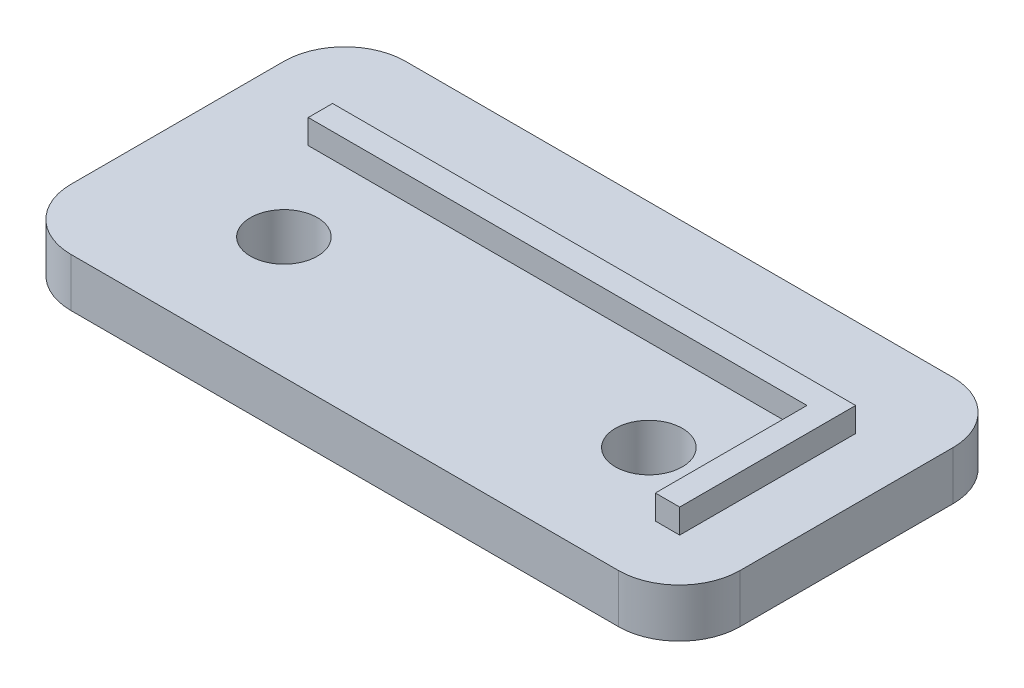
ISO-10303-21;
HEADER;
FILE_DESCRIPTION(('STEP AP214'),'2;1');
FILE_NAME('part.step','',(''),(''),'','','');
FILE_SCHEMA(('AUTOMOTIVE_DESIGN { 1 0 10303 214 1 1 1 1 }'));
ENDSEC;
DATA;
#1=APPLICATION_CONTEXT('core data for automotive mechanical design processes');
#2=APPLICATION_PROTOCOL_DEFINITION('international standard','automotive_design',2000,#1);
#3=PRODUCT_CONTEXT('',#1,'mechanical');
#4=PRODUCT('Part','Part','',(#3));
#5=PRODUCT_RELATED_PRODUCT_CATEGORY('part','',(#4));
#6=PRODUCT_DEFINITION_FORMATION('','',#4);
#7=PRODUCT_DEFINITION_CONTEXT('part definition',#1,'design');
#8=PRODUCT_DEFINITION('design','',#6,#7);
#9=PRODUCT_DEFINITION_SHAPE('','',#8);
#10=(LENGTH_UNIT() NAMED_UNIT(*) SI_UNIT(.MILLI.,.METRE.));
#11=(NAMED_UNIT(*) PLANE_ANGLE_UNIT() SI_UNIT($,.RADIAN.));
#12=(NAMED_UNIT(*) SI_UNIT($,.STERADIAN.) SOLID_ANGLE_UNIT());
#13=UNCERTAINTY_MEASURE_WITH_UNIT(LENGTH_MEASURE(1.E-05),#10,'distance_accuracy_value','');
#14=(GEOMETRIC_REPRESENTATION_CONTEXT(3) GLOBAL_UNCERTAINTY_ASSIGNED_CONTEXT((#13)) GLOBAL_UNIT_ASSIGNED_CONTEXT((#10,
#11,#12)) REPRESENTATION_CONTEXT('',''));
#15=CARTESIAN_POINT('',(0.,0.,0.));
#16=DIRECTION('',(0.,0.,1.));
#17=DIRECTION('',(1.,0.,0.));
#18=AXIS2_PLACEMENT_3D('',#15,#16,#17);
#19=CARTESIAN_POINT('',(0.,4.,0.));
#20=DIRECTION('',(0.,1.,0.));
#21=DIRECTION('',(0.,0.,1.));
#22=AXIS2_PLACEMENT_3D('',#19,#20,#21);
#23=PLANE('',#22);
#24=CARTESIAN_POINT('',(-12.5,4.,-10.));
#25=DIRECTION('',(0.,1.,0.));
#26=DIRECTION('',(0.,0.,1.));
#27=AXIS2_PLACEMENT_3D('',#24,#25,#26);
#28=CIRCLE('',#27,2.75);
#29=CARTESIAN_POINT('',(-12.5,4.,-7.25));
#30=VERTEX_POINT('',#29);
#31=EDGE_CURVE('E150',#30,#30,#28,.F.);
#32=ORIENTED_EDGE('',*,*,#31,.T.);
#33=EDGE_LOOP('',(#32));
#34=FACE_BOUND('',#33,.T.);
#35=DIRECTION('',(-1.,0.,0.));
#36=VECTOR('',#35,1.);
#37=CARTESIAN_POINT('',(0.,4.,-27.5));
#38=LINE('',#37,#36);
#39=CARTESIAN_POINT('',(-5.,4.,-27.5));
#40=VERTEX_POINT('',#39);
#41=CARTESIAN_POINT('',(-50.,4.,-27.5));
#42=VERTEX_POINT('',#41);
#43=EDGE_CURVE('E211',#40,#42,#38,.T.);
#44=ORIENTED_EDGE('',*,*,#43,.T.);
#45=CARTESIAN_POINT('',(-50.,4.,-22.5));
#46=DIRECTION('',(0.,1.,0.));
#47=DIRECTION('',(0.,0.,1.));
#48=AXIS2_PLACEMENT_3D('',#45,#46,#47);
#49=CIRCLE('',#48,5.);
#50=CARTESIAN_POINT('',(-55.,4.,-22.5));
#51=VERTEX_POINT('',#50);
#52=EDGE_CURVE('E255',#42,#51,#49,.T.);
#53=ORIENTED_EDGE('',*,*,#52,.T.);
#54=DIRECTION('',(0.,0.,1.));
#55=VECTOR('',#54,1.);
#56=CARTESIAN_POINT('',(-55.,4.,0.));
#57=LINE('',#56,#55);
#58=CARTESIAN_POINT('',(-55.,4.,-4.99999999999999));
#59=VERTEX_POINT('',#58);
#60=EDGE_CURVE('E215',#51,#59,#57,.T.);
#61=ORIENTED_EDGE('',*,*,#60,.T.);
#62=CARTESIAN_POINT('',(-50.,4.,-4.99999999999999));
#63=DIRECTION('',(0.,1.,0.));
#64=DIRECTION('',(0.,0.,1.));
#65=AXIS2_PLACEMENT_3D('',#62,#63,#64);
#66=CIRCLE('',#65,5.);
#67=CARTESIAN_POINT('',(-50.,4.,0.));
#68=VERTEX_POINT('',#67);
#69=EDGE_CURVE('E249',#59,#68,#66,.T.);
#70=ORIENTED_EDGE('',*,*,#69,.T.);
#71=DIRECTION('',(1.,0.,0.));
#72=VECTOR('',#71,1.);
#73=CARTESIAN_POINT('',(0.,4.,0.));
#74=LINE('',#73,#72);
#75=CARTESIAN_POINT('',(-5.,4.,0.));
#76=VERTEX_POINT('',#75);
#77=EDGE_CURVE('E218',#68,#76,#74,.T.);
#78=ORIENTED_EDGE('',*,*,#77,.T.);
#79=CARTESIAN_POINT('',(-5.,4.,-5.));
#80=DIRECTION('',(0.,1.,0.));
#81=DIRECTION('',(0.,0.,1.));
#82=AXIS2_PLACEMENT_3D('',#79,#80,#81);
#83=CIRCLE('',#82,5.);
#84=CARTESIAN_POINT('',(0.,4.,-5.));
#85=VERTEX_POINT('',#84);
#86=EDGE_CURVE('E251',#76,#85,#83,.T.);
#87=ORIENTED_EDGE('',*,*,#86,.T.);
#88=DIRECTION('',(0.,0.,-1.));
#89=VECTOR('',#88,1.);
#90=CARTESIAN_POINT('',(0.,4.,0.));
#91=LINE('',#90,#89);
#92=CARTESIAN_POINT('',(0.,4.,-22.5));
#93=VERTEX_POINT('',#92);
#94=EDGE_CURVE('E208',#85,#93,#91,.T.);
#95=ORIENTED_EDGE('',*,*,#94,.T.);
#96=CARTESIAN_POINT('',(-5.,4.,-22.5));
#97=DIRECTION('',(0.,1.,0.));
#98=DIRECTION('',(0.,0.,1.));
#99=AXIS2_PLACEMENT_3D('',#96,#97,#98);
#100=CIRCLE('',#99,5.);
#101=EDGE_CURVE('E253',#93,#40,#100,.T.);
#102=ORIENTED_EDGE('',*,*,#101,.T.);
#103=EDGE_LOOP('',(#44,#53,#61,#70,#78,#87,#95,#102));
#104=FACE_BOUND('',#103,.T.);
#105=CARTESIAN_POINT('',(-42.5,4.,-10.));
#106=DIRECTION('',(0.,1.,0.));
#107=DIRECTION('',(0.,0.,1.));
#108=AXIS2_PLACEMENT_3D('',#105,#106,#107);
#109=CIRCLE('',#108,2.75);
#110=CARTESIAN_POINT('',(-42.5,4.,-7.25));
#111=VERTEX_POINT('',#110);
#112=EDGE_CURVE('E200',#111,#111,#109,.T.);
#113=ORIENTED_EDGE('',*,*,#112,.F.);
#114=EDGE_LOOP('',(#113));
#115=FACE_BOUND('',#114,.T.);
#116=DIRECTION('',(0.,0.,1.));
#117=VECTOR('',#116,1.);
#118=CARTESIAN_POINT('',(-48.,4.,0.));
#119=LINE('',#118,#117);
#120=CARTESIAN_POINT('',(-48.,4.,-19.5));
#121=VERTEX_POINT('',#120);
#122=CARTESIAN_POINT('',(-48.,4.,-17.5));
#123=VERTEX_POINT('',#122);
#124=EDGE_CURVE('E176',#121,#123,#119,.T.);
#125=ORIENTED_EDGE('',*,*,#124,.F.);
#126=DIRECTION('',(1.,0.,0.));
#127=VECTOR('',#126,1.);
#128=CARTESIAN_POINT('',(0.,4.,-19.5));
#129=LINE('',#128,#127);
#130=CARTESIAN_POINT('',(-5.00000000000001,4.,-19.5));
#131=VERTEX_POINT('',#130);
#132=EDGE_CURVE('E58',#121,#131,#129,.T.);
#133=ORIENTED_EDGE('',*,*,#132,.T.);
#134=DIRECTION('',(0.,0.,1.));
#135=VECTOR('',#134,1.);
#136=CARTESIAN_POINT('',(-5.00000000000001,4.,0.));
#137=LINE('',#136,#135);
#138=CARTESIAN_POINT('',(-5.00000000000001,4.,-5.03579234898707));
#139=VERTEX_POINT('',#138);
#140=EDGE_CURVE('E63',#131,#139,#137,.T.);
#141=ORIENTED_EDGE('',*,*,#140,.T.);
#142=DIRECTION('',(1.,0.,0.));
#143=VECTOR('',#142,1.);
#144=CARTESIAN_POINT('',(0.,4.,-5.03579234898707));
#145=LINE('',#144,#143);
#146=CARTESIAN_POINT('',(-7.00000000000001,4.,-5.03579234898707));
#147=VERTEX_POINT('',#146);
#148=EDGE_CURVE('E165',#147,#139,#145,.T.);
#149=ORIENTED_EDGE('',*,*,#148,.F.);
#150=DIRECTION('',(0.,0.,1.));
#151=VECTOR('',#150,1.);
#152=CARTESIAN_POINT('',(-7.,4.,0.));
#153=LINE('',#152,#151);
#154=CARTESIAN_POINT('',(-7.00000000000001,4.,-17.5));
#155=VERTEX_POINT('',#154);
#156=EDGE_CURVE('E181',#155,#147,#153,.T.);
#157=ORIENTED_EDGE('',*,*,#156,.F.);
#158=DIRECTION('',(1.,0.,0.));
#159=VECTOR('',#158,1.);
#160=CARTESIAN_POINT('',(0.,4.,-17.5));
#161=LINE('',#160,#159);
#162=EDGE_CURVE('E178',#123,#155,#161,.T.);
#163=ORIENTED_EDGE('',*,*,#162,.F.);
#164=EDGE_LOOP('',(#125,#133,#141,#149,#157,#163));
#165=FACE_BOUND('',#164,.T.);
#166=ADVANCED_FACE('F43',(#34,#104,#115,#165),#23,.T.);
#167=CARTESIAN_POINT('',(0.,0.,0.));
#168=DIRECTION('',(0.,1.,0.));
#169=DIRECTION('',(0.,0.,1.));
#170=AXIS2_PLACEMENT_3D('',#167,#168,#169);
#171=PLANE('',#170);
#172=DIRECTION('',(0.,0.,1.));
#173=VECTOR('',#172,1.);
#174=CARTESIAN_POINT('',(-55.,0.,0.));
#175=LINE('',#174,#173);
#176=CARTESIAN_POINT('',(-55.,0.,-22.5));
#177=VERTEX_POINT('',#176);
#178=CARTESIAN_POINT('',(-55.,0.,-4.99999999999999));
#179=VERTEX_POINT('',#178);
#180=EDGE_CURVE('E227',#177,#179,#175,.T.);
#181=ORIENTED_EDGE('',*,*,#180,.F.);
#182=CARTESIAN_POINT('',(-50.,0.,-22.5));
#183=DIRECTION('',(0.,1.,0.));
#184=DIRECTION('',(0.,0.,1.));
#185=AXIS2_PLACEMENT_3D('',#182,#183,#184);
#186=CIRCLE('',#185,5.);
#187=CARTESIAN_POINT('',(-50.,0.,-27.5));
#188=VERTEX_POINT('',#187);
#189=EDGE_CURVE('E242',#177,#188,#186,.F.);
#190=ORIENTED_EDGE('',*,*,#189,.T.);
#191=DIRECTION('',(-1.,0.,0.));
#192=VECTOR('',#191,1.);
#193=CARTESIAN_POINT('',(0.,0.,-27.5));
#194=LINE('',#193,#192);
#195=CARTESIAN_POINT('',(-5.,0.,-27.5));
#196=VERTEX_POINT('',#195);
#197=EDGE_CURVE('E224',#196,#188,#194,.T.);
#198=ORIENTED_EDGE('',*,*,#197,.F.);
#199=CARTESIAN_POINT('',(-5.,0.,-22.5));
#200=DIRECTION('',(0.,1.,0.));
#201=DIRECTION('',(0.,0.,1.));
#202=AXIS2_PLACEMENT_3D('',#199,#200,#201);
#203=CIRCLE('',#202,5.);
#204=CARTESIAN_POINT('',(0.,0.,-22.5));
#205=VERTEX_POINT('',#204);
#206=EDGE_CURVE('E240',#196,#205,#203,.F.);
#207=ORIENTED_EDGE('',*,*,#206,.T.);
#208=DIRECTION('',(0.,0.,-1.));
#209=VECTOR('',#208,1.);
#210=CARTESIAN_POINT('',(0.,0.,0.));
#211=LINE('',#210,#209);
#212=CARTESIAN_POINT('',(0.,0.,-5.));
#213=VERTEX_POINT('',#212);
#214=EDGE_CURVE('E199',#213,#205,#211,.T.);
#215=ORIENTED_EDGE('',*,*,#214,.F.);
#216=CARTESIAN_POINT('',(-5.,0.,-5.));
#217=DIRECTION('',(0.,1.,0.));
#218=DIRECTION('',(0.,0.,1.));
#219=AXIS2_PLACEMENT_3D('',#216,#217,#218);
#220=CIRCLE('',#219,5.);
#221=CARTESIAN_POINT('',(-5.,0.,0.));
#222=VERTEX_POINT('',#221);
#223=EDGE_CURVE('E238',#213,#222,#220,.F.);
#224=ORIENTED_EDGE('',*,*,#223,.T.);
#225=DIRECTION('',(1.,0.,0.));
#226=VECTOR('',#225,1.);
#227=CARTESIAN_POINT('',(0.,0.,0.));
#228=LINE('',#227,#226);
#229=CARTESIAN_POINT('',(-50.,0.,0.));
#230=VERTEX_POINT('',#229);
#231=EDGE_CURVE('E212',#230,#222,#228,.T.);
#232=ORIENTED_EDGE('',*,*,#231,.F.);
#233=CARTESIAN_POINT('',(-50.,0.,-4.99999999999999));
#234=DIRECTION('',(0.,1.,0.));
#235=DIRECTION('',(0.,0.,1.));
#236=AXIS2_PLACEMENT_3D('',#233,#234,#235);
#237=CIRCLE('',#236,5.);
#238=EDGE_CURVE('E236',#230,#179,#237,.F.);
#239=ORIENTED_EDGE('',*,*,#238,.T.);
#240=EDGE_LOOP('',(#181,#190,#198,#207,#215,#224,#232,#239));
#241=FACE_BOUND('',#240,.T.);
#242=CARTESIAN_POINT('',(-12.5,0.,-10.));
#243=DIRECTION('',(0.,1.,0.));
#244=DIRECTION('',(0.,0.,1.));
#245=AXIS2_PLACEMENT_3D('',#242,#243,#244);
#246=CIRCLE('',#245,2.75);
#247=CARTESIAN_POINT('',(-12.5,0.,-7.25));
#248=VERTEX_POINT('',#247);
#249=EDGE_CURVE('E203',#248,#248,#246,.F.);
#250=ORIENTED_EDGE('',*,*,#249,.F.);
#251=EDGE_LOOP('',(#250));
#252=FACE_BOUND('',#251,.T.);
#253=CARTESIAN_POINT('',(-42.5,0.,-10.));
#254=DIRECTION('',(0.,1.,0.));
#255=DIRECTION('',(0.,0.,1.));
#256=AXIS2_PLACEMENT_3D('',#253,#254,#255);
#257=CIRCLE('',#256,2.75);
#258=CARTESIAN_POINT('',(-42.5,0.,-7.25));
#259=VERTEX_POINT('',#258);
#260=EDGE_CURVE('E196',#259,#259,#257,.T.);
#261=ORIENTED_EDGE('',*,*,#260,.T.);
#262=EDGE_LOOP('',(#261));
#263=FACE_BOUND('',#262,.T.);
#264=ADVANCED_FACE('F272',(#241,#252,#263),#171,.F.);
#265=CARTESIAN_POINT('',(0.,4.,0.));
#266=DIRECTION('',(-1.,0.,0.));
#267=DIRECTION('',(0.,0.,1.));
#268=AXIS2_PLACEMENT_3D('',#265,#266,#267);
#269=PLANE('',#268);
#270=ORIENTED_EDGE('',*,*,#214,.T.);
#271=DIRECTION('',(0.,-1.,0.));
#272=VECTOR('',#271,1.);
#273=CARTESIAN_POINT('',(0.,4.,-22.5));
#274=LINE('',#273,#272);
#275=EDGE_CURVE('E260',#205,#93,#274,.F.);
#276=ORIENTED_EDGE('',*,*,#275,.T.);
#277=ORIENTED_EDGE('',*,*,#94,.F.);
#278=DIRECTION('',(0.,-1.,0.));
#279=VECTOR('',#278,1.);
#280=CARTESIAN_POINT('',(0.,4.,-5.));
#281=LINE('',#280,#279);
#282=EDGE_CURVE('E257',#85,#213,#281,.T.);
#283=ORIENTED_EDGE('',*,*,#282,.T.);
#284=EDGE_LOOP('',(#270,#276,#277,#283));
#285=FACE_BOUND('',#284,.T.);
#286=ADVANCED_FACE('F281',(#285),#269,.F.);
#287=CARTESIAN_POINT('',(0.,4.,-27.5));
#288=DIRECTION('',(0.,0.,1.));
#289=DIRECTION('',(1.,0.,0.));
#290=AXIS2_PLACEMENT_3D('',#287,#288,#289);
#291=PLANE('',#290);
#292=ORIENTED_EDGE('',*,*,#197,.T.);
#293=DIRECTION('',(0.,-1.,0.));
#294=VECTOR('',#293,1.);
#295=CARTESIAN_POINT('',(-50.,4.,-27.5));
#296=LINE('',#295,#294);
#297=EDGE_CURVE('E247',#188,#42,#296,.F.);
#298=ORIENTED_EDGE('',*,*,#297,.T.);
#299=ORIENTED_EDGE('',*,*,#43,.F.);
#300=DIRECTION('',(0.,-1.,0.));
#301=VECTOR('',#300,1.);
#302=CARTESIAN_POINT('',(-5.,4.,-27.5));
#303=LINE('',#302,#301);
#304=EDGE_CURVE('E244',#40,#196,#303,.T.);
#305=ORIENTED_EDGE('',*,*,#304,.T.);
#306=EDGE_LOOP('',(#292,#298,#299,#305));
#307=FACE_BOUND('',#306,.T.);
#308=ADVANCED_FACE('F292',(#307),#291,.F.);
#309=CARTESIAN_POINT('',(-55.,4.,0.));
#310=DIRECTION('',(1.,0.,0.));
#311=DIRECTION('',(0.,0.,-1.));
#312=AXIS2_PLACEMENT_3D('',#309,#310,#311);
#313=PLANE('',#312);
#314=ORIENTED_EDGE('',*,*,#60,.F.);
#315=DIRECTION('',(0.,-1.,0.));
#316=VECTOR('',#315,1.);
#317=CARTESIAN_POINT('',(-55.,4.,-22.5));
#318=LINE('',#317,#316);
#319=EDGE_CURVE('E233',#51,#177,#318,.T.);
#320=ORIENTED_EDGE('',*,*,#319,.T.);
#321=ORIENTED_EDGE('',*,*,#180,.T.);
#322=DIRECTION('',(0.,-1.,0.));
#323=VECTOR('',#322,1.);
#324=CARTESIAN_POINT('',(-55.,4.,-4.99999999999999));
#325=LINE('',#324,#323);
#326=EDGE_CURVE('E221',#179,#59,#325,.F.);
#327=ORIENTED_EDGE('',*,*,#326,.T.);
#328=EDGE_LOOP('',(#314,#320,#321,#327));
#329=FACE_BOUND('',#328,.T.);
#330=ADVANCED_FACE('F300',(#329),#313,.F.);
#331=CARTESIAN_POINT('',(0.,4.,0.));
#332=DIRECTION('',(0.,0.,-1.));
#333=DIRECTION('',(-1.,0.,0.));
#334=AXIS2_PLACEMENT_3D('',#331,#332,#333);
#335=PLANE('',#334);
#336=ORIENTED_EDGE('',*,*,#231,.T.);
#337=DIRECTION('',(0.,-1.,0.));
#338=VECTOR('',#337,1.);
#339=CARTESIAN_POINT('',(-5.,4.,0.));
#340=LINE('',#339,#338);
#341=EDGE_CURVE('E11',#222,#76,#340,.F.);
#342=ORIENTED_EDGE('',*,*,#341,.T.);
#343=ORIENTED_EDGE('',*,*,#77,.F.);
#344=DIRECTION('',(0.,-1.,0.));
#345=VECTOR('',#344,1.);
#346=CARTESIAN_POINT('',(-50.,4.,0.));
#347=LINE('',#346,#345);
#348=EDGE_CURVE('E51',#68,#230,#347,.T.);
#349=ORIENTED_EDGE('',*,*,#348,.T.);
#350=EDGE_LOOP('',(#336,#342,#343,#349));
#351=FACE_BOUND('',#350,.T.);
#352=ADVANCED_FACE('F266',(#351),#335,.F.);
#353=CARTESIAN_POINT('',(-12.5,0.,-10.));
#354=DIRECTION('',(0.,1.,0.));
#355=DIRECTION('',(0.,0.,1.));
#356=AXIS2_PLACEMENT_3D('',#353,#354,#355);
#357=CYLINDRICAL_SURFACE('',#356,2.75);
#358=ORIENTED_EDGE('',*,*,#249,.T.);
#359=EDGE_LOOP('',(#358));
#360=FACE_BOUND('',#359,.T.);
#361=ORIENTED_EDGE('',*,*,#31,.F.);
#362=EDGE_LOOP('',(#361));
#363=FACE_BOUND('',#362,.T.);
#364=ADVANCED_FACE('F316',(#360,#363),#357,.F.);
#365=CARTESIAN_POINT('',(-42.5,0.,-10.));
#366=DIRECTION('',(0.,1.,0.));
#367=DIRECTION('',(0.,0.,1.));
#368=AXIS2_PLACEMENT_3D('',#365,#366,#367);
#369=CYLINDRICAL_SURFACE('',#368,2.75);
#370=ORIENTED_EDGE('',*,*,#260,.F.);
#371=EDGE_LOOP('',(#370));
#372=FACE_BOUND('',#371,.T.);
#373=ORIENTED_EDGE('',*,*,#112,.T.);
#374=EDGE_LOOP('',(#373));
#375=FACE_BOUND('',#374,.T.);
#376=ADVANCED_FACE('F329',(#372,#375),#369,.F.);
#377=CARTESIAN_POINT('',(-50.,4.,-22.5));
#378=DIRECTION('',(0.,-1.,0.));
#379=DIRECTION('',(0.,0.,-1.));
#380=AXIS2_PLACEMENT_3D('',#377,#378,#379);
#381=CYLINDRICAL_SURFACE('',#380,5.);
#382=ORIENTED_EDGE('',*,*,#52,.F.);
#383=ORIENTED_EDGE('',*,*,#297,.F.);
#384=ORIENTED_EDGE('',*,*,#189,.F.);
#385=ORIENTED_EDGE('',*,*,#319,.F.);
#386=EDGE_LOOP('',(#382,#383,#384,#385));
#387=FACE_BOUND('',#386,.T.);
#388=ADVANCED_FACE('F297',(#387),#381,.T.);
#389=CARTESIAN_POINT('',(-5.,4.,-22.5));
#390=DIRECTION('',(0.,-1.,0.));
#391=DIRECTION('',(0.,0.,-1.));
#392=AXIS2_PLACEMENT_3D('',#389,#390,#391);
#393=CYLINDRICAL_SURFACE('',#392,5.);
#394=ORIENTED_EDGE('',*,*,#101,.F.);
#395=ORIENTED_EDGE('',*,*,#275,.F.);
#396=ORIENTED_EDGE('',*,*,#206,.F.);
#397=ORIENTED_EDGE('',*,*,#304,.F.);
#398=EDGE_LOOP('',(#394,#395,#396,#397));
#399=FACE_BOUND('',#398,.T.);
#400=ADVANCED_FACE('F289',(#399),#393,.T.);
#401=CARTESIAN_POINT('',(-5.,4.,-5.));
#402=DIRECTION('',(0.,-1.,0.));
#403=DIRECTION('',(0.,0.,-1.));
#404=AXIS2_PLACEMENT_3D('',#401,#402,#403);
#405=CYLINDRICAL_SURFACE('',#404,5.);
#406=ORIENTED_EDGE('',*,*,#86,.F.);
#407=ORIENTED_EDGE('',*,*,#341,.F.);
#408=ORIENTED_EDGE('',*,*,#223,.F.);
#409=ORIENTED_EDGE('',*,*,#282,.F.);
#410=EDGE_LOOP('',(#406,#407,#408,#409));
#411=FACE_BOUND('',#410,.T.);
#412=ADVANCED_FACE('F278',(#411),#405,.T.);
#413=CARTESIAN_POINT('',(-50.,4.,-4.99999999999999));
#414=DIRECTION('',(0.,-1.,0.));
#415=DIRECTION('',(0.,0.,-1.));
#416=AXIS2_PLACEMENT_3D('',#413,#414,#415);
#417=CYLINDRICAL_SURFACE('',#416,5.);
#418=ORIENTED_EDGE('',*,*,#69,.F.);
#419=ORIENTED_EDGE('',*,*,#326,.F.);
#420=ORIENTED_EDGE('',*,*,#238,.F.);
#421=ORIENTED_EDGE('',*,*,#348,.F.);
#422=EDGE_LOOP('',(#418,#419,#420,#421));
#423=FACE_BOUND('',#422,.T.);
#424=ADVANCED_FACE('F45',(#423),#417,.T.);
#425=CARTESIAN_POINT('',(0.,6.,-19.5));
#426=DIRECTION('',(0.,0.,-1.));
#427=DIRECTION('',(-1.,0.,0.));
#428=AXIS2_PLACEMENT_3D('',#425,#426,#427);
#429=PLANE('',#428);
#430=ORIENTED_EDGE('',*,*,#132,.F.);
#431=DIRECTION('',(0.,-1.,0.));
#432=VECTOR('',#431,1.);
#433=CARTESIAN_POINT('',(-48.,6.,-19.5));
#434=LINE('',#433,#432);
#435=CARTESIAN_POINT('',(-48.,6.,-19.5));
#436=VERTEX_POINT('',#435);
#437=EDGE_CURVE('E142',#436,#121,#434,.T.);
#438=ORIENTED_EDGE('',*,*,#437,.F.);
#439=DIRECTION('',(1.,0.,0.));
#440=VECTOR('',#439,1.);
#441=CARTESIAN_POINT('',(0.,6.,-19.5));
#442=LINE('',#441,#440);
#443=CARTESIAN_POINT('',(-5.00000000000001,6.,-19.5));
#444=VERTEX_POINT('',#443);
#445=EDGE_CURVE('E146',#436,#444,#442,.T.);
#446=ORIENTED_EDGE('',*,*,#445,.T.);
#447=DIRECTION('',(0.,-1.,0.));
#448=VECTOR('',#447,1.);
#449=CARTESIAN_POINT('',(-5.00000000000001,6.,-19.5));
#450=LINE('',#449,#448);
#451=EDGE_CURVE('E174',#444,#131,#450,.T.);
#452=ORIENTED_EDGE('',*,*,#451,.T.);
#453=EDGE_LOOP('',(#430,#438,#446,#452));
#454=FACE_BOUND('',#453,.T.);
#455=ADVANCED_FACE('F144',(#454),#429,.T.);
#456=CARTESIAN_POINT('',(-48.,6.,0.));
#457=DIRECTION('',(1.,0.,0.));
#458=DIRECTION('',(0.,0.,-1.));
#459=AXIS2_PLACEMENT_3D('',#456,#457,#458);
#460=PLANE('',#459);
#461=ORIENTED_EDGE('',*,*,#124,.T.);
#462=DIRECTION('',(0.,-1.,0.));
#463=VECTOR('',#462,1.);
#464=CARTESIAN_POINT('',(-48.,6.,-17.5));
#465=LINE('',#464,#463);
#466=CARTESIAN_POINT('',(-48.,6.,-17.5));
#467=VERTEX_POINT('',#466);
#468=EDGE_CURVE('E151',#467,#123,#465,.T.);
#469=ORIENTED_EDGE('',*,*,#468,.F.);
#470=DIRECTION('',(0.,0.,1.));
#471=VECTOR('',#470,1.);
#472=CARTESIAN_POINT('',(-48.,6.,0.));
#473=LINE('',#472,#471);
#474=EDGE_CURVE('E154',#436,#467,#473,.T.);
#475=ORIENTED_EDGE('',*,*,#474,.F.);
#476=ORIENTED_EDGE('',*,*,#437,.T.);
#477=EDGE_LOOP('',(#461,#469,#475,#476));
#478=FACE_BOUND('',#477,.T.);
#479=ADVANCED_FACE('F155',(#478),#460,.F.);
#480=CARTESIAN_POINT('',(0.,6.,-17.5));
#481=DIRECTION('',(0.,0.,-1.));
#482=DIRECTION('',(-1.,0.,0.));
#483=AXIS2_PLACEMENT_3D('',#480,#481,#482);
#484=PLANE('',#483);
#485=ORIENTED_EDGE('',*,*,#162,.T.);
#486=DIRECTION('',(0.,-1.,0.));
#487=VECTOR('',#486,1.);
#488=CARTESIAN_POINT('',(-7.00000000000001,6.,-17.5));
#489=LINE('',#488,#487);
#490=CARTESIAN_POINT('',(-7.00000000000001,6.,-17.5));
#491=VERTEX_POINT('',#490);
#492=EDGE_CURVE('E192',#491,#155,#489,.T.);
#493=ORIENTED_EDGE('',*,*,#492,.F.);
#494=DIRECTION('',(1.,0.,0.));
#495=VECTOR('',#494,1.);
#496=CARTESIAN_POINT('',(0.,6.,-17.5));
#497=LINE('',#496,#495);
#498=EDGE_CURVE('E159',#467,#491,#497,.T.);
#499=ORIENTED_EDGE('',*,*,#498,.F.);
#500=ORIENTED_EDGE('',*,*,#468,.T.);
#501=EDGE_LOOP('',(#485,#493,#499,#500));
#502=FACE_BOUND('',#501,.T.);
#503=ADVANCED_FACE('F367',(#502),#484,.F.);
#504=CARTESIAN_POINT('',(-7.,6.,0.));
#505=DIRECTION('',(1.,0.,0.));
#506=DIRECTION('',(0.,0.,-1.));
#507=AXIS2_PLACEMENT_3D('',#504,#505,#506);
#508=PLANE('',#507);
#509=ORIENTED_EDGE('',*,*,#156,.T.);
#510=DIRECTION('',(0.,-1.,0.));
#511=VECTOR('',#510,1.);
#512=CARTESIAN_POINT('',(-7.00000000000001,6.,-5.03579234898707));
#513=LINE('',#512,#511);
#514=CARTESIAN_POINT('',(-7.00000000000001,6.,-5.03579234898707));
#515=VERTEX_POINT('',#514);
#516=EDGE_CURVE('E189',#515,#147,#513,.T.);
#517=ORIENTED_EDGE('',*,*,#516,.F.);
#518=DIRECTION('',(0.,0.,1.));
#519=VECTOR('',#518,1.);
#520=CARTESIAN_POINT('',(-7.,6.,0.));
#521=LINE('',#520,#519);
#522=EDGE_CURVE('E169',#491,#515,#521,.T.);
#523=ORIENTED_EDGE('',*,*,#522,.F.);
#524=ORIENTED_EDGE('',*,*,#492,.T.);
#525=EDGE_LOOP('',(#509,#517,#523,#524));
#526=FACE_BOUND('',#525,.T.);
#527=ADVANCED_FACE('F376',(#526),#508,.F.);
#528=CARTESIAN_POINT('',(0.,6.,-5.03579234898707));
#529=DIRECTION('',(0.,0.,-1.));
#530=DIRECTION('',(-1.,0.,0.));
#531=AXIS2_PLACEMENT_3D('',#528,#529,#530);
#532=PLANE('',#531);
#533=ORIENTED_EDGE('',*,*,#148,.T.);
#534=DIRECTION('',(0.,-1.,0.));
#535=VECTOR('',#534,1.);
#536=CARTESIAN_POINT('',(-5.00000000000001,6.,-5.03579234898707));
#537=LINE('',#536,#535);
#538=CARTESIAN_POINT('',(-5.00000000000001,6.,-5.03579234898707));
#539=VERTEX_POINT('',#538);
#540=EDGE_CURVE('E187',#539,#139,#537,.T.);
#541=ORIENTED_EDGE('',*,*,#540,.F.);
#542=DIRECTION('',(1.,0.,0.));
#543=VECTOR('',#542,1.);
#544=CARTESIAN_POINT('',(0.,6.,-5.03579234898707));
#545=LINE('',#544,#543);
#546=EDGE_CURVE('E171',#515,#539,#545,.T.);
#547=ORIENTED_EDGE('',*,*,#546,.F.);
#548=ORIENTED_EDGE('',*,*,#516,.T.);
#549=EDGE_LOOP('',(#533,#541,#547,#548));
#550=FACE_BOUND('',#549,.T.);
#551=ADVANCED_FACE('F386',(#550),#532,.F.);
#552=CARTESIAN_POINT('',(-5.00000000000001,6.,0.));
#553=DIRECTION('',(1.,0.,0.));
#554=DIRECTION('',(0.,0.,-1.));
#555=AXIS2_PLACEMENT_3D('',#552,#553,#554);
#556=PLANE('',#555);
#557=ORIENTED_EDGE('',*,*,#140,.F.);
#558=ORIENTED_EDGE('',*,*,#451,.F.);
#559=DIRECTION('',(0.,0.,1.));
#560=VECTOR('',#559,1.);
#561=CARTESIAN_POINT('',(-5.00000000000001,6.,0.));
#562=LINE('',#561,#560);
#563=EDGE_CURVE('E163',#444,#539,#562,.T.);
#564=ORIENTED_EDGE('',*,*,#563,.T.);
#565=ORIENTED_EDGE('',*,*,#540,.T.);
#566=EDGE_LOOP('',(#557,#558,#564,#565));
#567=FACE_BOUND('',#566,.T.);
#568=ADVANCED_FACE('F396',(#567),#556,.T.);
#569=CARTESIAN_POINT('',(0.,6.,0.));
#570=DIRECTION('',(0.,1.,0.));
#571=DIRECTION('',(0.,0.,1.));
#572=AXIS2_PLACEMENT_3D('',#569,#570,#571);
#573=PLANE('',#572);
#574=ORIENTED_EDGE('',*,*,#445,.F.);
#575=ORIENTED_EDGE('',*,*,#474,.T.);
#576=ORIENTED_EDGE('',*,*,#498,.T.);
#577=ORIENTED_EDGE('',*,*,#522,.T.);
#578=ORIENTED_EDGE('',*,*,#546,.T.);
#579=ORIENTED_EDGE('',*,*,#563,.F.);
#580=EDGE_LOOP('',(#574,#575,#576,#577,#578,#579));
#581=FACE_BOUND('',#580,.T.);
#582=ADVANCED_FACE('F161',(#581),#573,.T.);
#583=CLOSED_SHELL('',(#166,#264,#286,#308,#330,#352,#364,#376,#388,#400,#412,#424,#455,#479,
#503,#527,#551,#568,#582));
#584=MANIFOLD_SOLID_BREP('B2',#583);
#585=ADVANCED_BREP_SHAPE_REPRESENTATION('',(#18,#584),#14);
#586=SHAPE_DEFINITION_REPRESENTATION(#9,#585);
ENDSEC;
END-ISO-10303-21;
